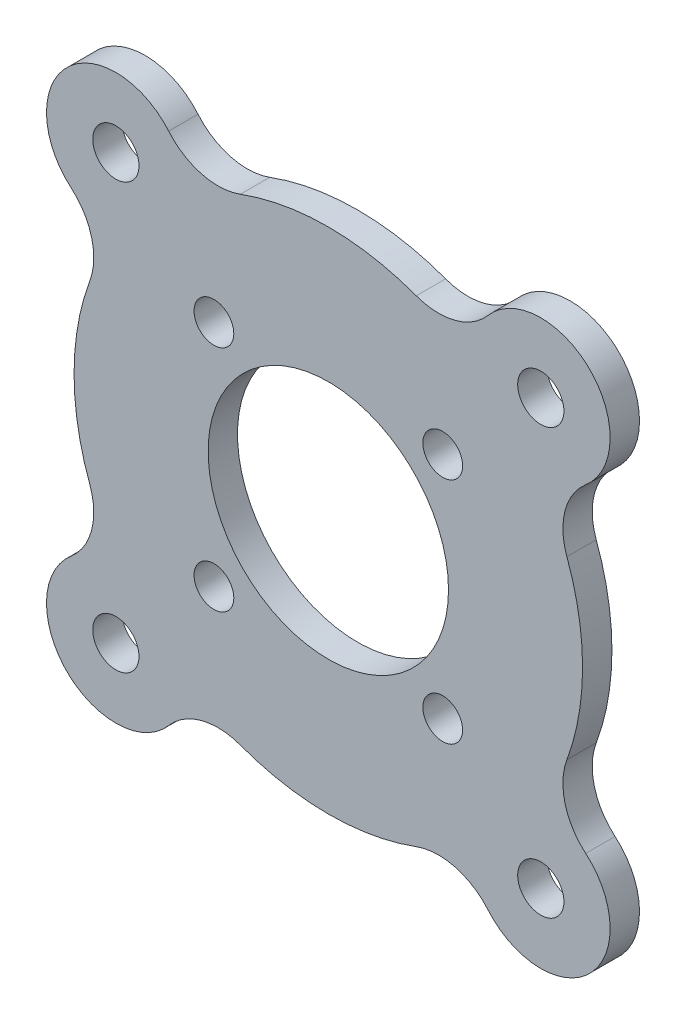
ISO-10303-21;
HEADER;
FILE_DESCRIPTION(('STEP AP214'),'2;1');
FILE_NAME('part.step','',(''),(''),'','','');
FILE_SCHEMA(('AUTOMOTIVE_DESIGN { 1 0 10303 214 1 1 1 1 }'));
ENDSEC;
DATA;
#1=APPLICATION_CONTEXT('core data for automotive mechanical design processes');
#2=APPLICATION_PROTOCOL_DEFINITION('international standard','automotive_design',2000,#1);
#3=PRODUCT_CONTEXT('',#1,'mechanical');
#4=PRODUCT('Part','Part','',(#3));
#5=PRODUCT_RELATED_PRODUCT_CATEGORY('part','',(#4));
#6=PRODUCT_DEFINITION_FORMATION('','',#4);
#7=PRODUCT_DEFINITION_CONTEXT('part definition',#1,'design');
#8=PRODUCT_DEFINITION('design','',#6,#7);
#9=PRODUCT_DEFINITION_SHAPE('','',#8);
#10=(LENGTH_UNIT() NAMED_UNIT(*) SI_UNIT(.MILLI.,.METRE.));
#11=(NAMED_UNIT(*) PLANE_ANGLE_UNIT() SI_UNIT($,.RADIAN.));
#12=(NAMED_UNIT(*) SI_UNIT($,.STERADIAN.) SOLID_ANGLE_UNIT());
#13=UNCERTAINTY_MEASURE_WITH_UNIT(LENGTH_MEASURE(1.E-05),#10,'distance_accuracy_value','');
#14=(GEOMETRIC_REPRESENTATION_CONTEXT(3) GLOBAL_UNCERTAINTY_ASSIGNED_CONTEXT((#13)) GLOBAL_UNIT_ASSIGNED_CONTEXT((#10,
#11,#12)) REPRESENTATION_CONTEXT('',''));
#15=CARTESIAN_POINT('',(0.,0.,0.));
#16=DIRECTION('',(0.,0.,1.));
#17=DIRECTION('',(1.,0.,0.));
#18=AXIS2_PLACEMENT_3D('',#15,#16,#17);
#19=CARTESIAN_POINT('',(22.9809703885628,-22.9809703885628,1.5875));
#20=DIRECTION('',(0.,0.,-1.));
#21=DIRECTION('',(-1.,0.,0.));
#22=AXIS2_PLACEMENT_3D('',#19,#20,#21);
#23=CYLINDRICAL_SURFACE('',#22,7.5);
#24=CARTESIAN_POINT('',(22.9809703885628,-22.9809703885628,-1.5875));
#25=DIRECTION('',(0.,0.,1.));
#26=DIRECTION('',(1.,0.,0.));
#27=AXIS2_PLACEMENT_3D('',#24,#25,#26);
#28=CIRCLE('',#27,7.5);
#29=CARTESIAN_POINT('',(17.2660064795565,-27.8378405246438,-1.5875));
#30=VERTEX_POINT('',#29);
#31=CARTESIAN_POINT('',(27.8378405246438,-17.2660064795565,-1.5875));
#32=VERTEX_POINT('',#31);
#33=EDGE_CURVE('E184',#30,#32,#28,.T.);
#34=ORIENTED_EDGE('',*,*,#33,.T.);
#35=DIRECTION('',(0.,0.,-1.));
#36=VECTOR('',#35,1.);
#37=CARTESIAN_POINT('',(27.8378405246438,-17.2660064795565,1.5875));
#38=LINE('',#37,#36);
#39=CARTESIAN_POINT('',(27.8378405246438,-17.2660064795565,1.5875));
#40=VERTEX_POINT('',#39);
#41=EDGE_CURVE('E201',#32,#40,#38,.F.);
#42=ORIENTED_EDGE('',*,*,#41,.T.);
#43=CARTESIAN_POINT('',(22.9809703885628,-22.9809703885628,1.5875));
#44=DIRECTION('',(0.,0.,1.));
#45=DIRECTION('',(1.,0.,0.));
#46=AXIS2_PLACEMENT_3D('',#43,#44,#45);
#47=CIRCLE('',#46,7.5);
#48=CARTESIAN_POINT('',(17.2660064795565,-27.8378405246438,1.5875));
#49=VERTEX_POINT('',#48);
#50=EDGE_CURVE('E288',#49,#40,#47,.T.);
#51=ORIENTED_EDGE('',*,*,#50,.F.);
#52=DIRECTION('',(0.,0.,-1.));
#53=VECTOR('',#52,1.);
#54=CARTESIAN_POINT('',(17.2660064795565,-27.8378405246438,1.5875));
#55=LINE('',#54,#53);
#56=EDGE_CURVE('E198',#49,#30,#55,.T.);
#57=ORIENTED_EDGE('',*,*,#56,.T.);
#58=EDGE_LOOP('',(#34,#42,#51,#57));
#59=FACE_BOUND('',#58,.T.);
#60=ADVANCED_FACE('F37',(#59),#23,.T.);
#61=CARTESIAN_POINT('',(0.,0.,1.5875));
#62=DIRECTION('',(0.,0.,-1.));
#63=DIRECTION('',(-1.,0.,0.));
#64=AXIS2_PLACEMENT_3D('',#61,#62,#63);
#65=CYLINDRICAL_SURFACE('',#64,27.5);
#66=CARTESIAN_POINT('',(0.,0.,-1.5875));
#67=DIRECTION('',(0.,0.,1.));
#68=DIRECTION('',(1.,0.,0.));
#69=AXIS2_PLACEMENT_3D('',#66,#67,#68);
#70=CIRCLE('',#69,27.5);
#71=CARTESIAN_POINT('',(25.8029067030082,-9.51104650792199,-1.5875));
#72=VERTEX_POINT('',#71);
#73=CARTESIAN_POINT('',(25.8029067030082,9.51104650792198,-1.5875));
#74=VERTEX_POINT('',#73);
#75=EDGE_CURVE('E179',#72,#74,#70,.T.);
#76=ORIENTED_EDGE('',*,*,#75,.T.);
#77=DIRECTION('',(0.,0.,-1.));
#78=VECTOR('',#77,1.);
#79=CARTESIAN_POINT('',(25.8029067030082,9.51104650792198,1.5875));
#80=LINE('',#79,#78);
#81=CARTESIAN_POINT('',(25.8029067030082,9.51104650792198,1.5875));
#82=VERTEX_POINT('',#81);
#83=EDGE_CURVE('E156',#74,#82,#80,.F.);
#84=ORIENTED_EDGE('',*,*,#83,.T.);
#85=CARTESIAN_POINT('',(0.,0.,1.5875));
#86=DIRECTION('',(0.,0.,1.));
#87=DIRECTION('',(1.,0.,0.));
#88=AXIS2_PLACEMENT_3D('',#85,#86,#87);
#89=CIRCLE('',#88,27.5);
#90=CARTESIAN_POINT('',(25.8029067030082,-9.51104650792199,1.5875));
#91=VERTEX_POINT('',#90);
#92=EDGE_CURVE('E269',#91,#82,#89,.T.);
#93=ORIENTED_EDGE('',*,*,#92,.F.);
#94=DIRECTION('',(0.,0.,-1.));
#95=VECTOR('',#94,1.);
#96=CARTESIAN_POINT('',(25.8029067030082,-9.51104650792199,1.5875));
#97=LINE('',#96,#95);
#98=EDGE_CURVE('E171',#91,#72,#97,.T.);
#99=ORIENTED_EDGE('',*,*,#98,.T.);
#100=EDGE_LOOP('',(#76,#84,#93,#99));
#101=FACE_BOUND('',#100,.T.);
#102=ADVANCED_FACE('F328',(#101),#65,.T.);
#103=CARTESIAN_POINT('',(22.9809703885628,22.9809703885628,1.5875));
#104=DIRECTION('',(0.,0.,-1.));
#105=DIRECTION('',(-1.,0.,0.));
#106=AXIS2_PLACEMENT_3D('',#103,#104,#105);
#107=CYLINDRICAL_SURFACE('',#106,7.5);
#108=CARTESIAN_POINT('',(22.9809703885628,22.9809703885628,1.5875));
#109=DIRECTION('',(0.,0.,1.));
#110=DIRECTION('',(1.,0.,0.));
#111=AXIS2_PLACEMENT_3D('',#108,#109,#110);
#112=CIRCLE('',#111,7.5);
#113=CARTESIAN_POINT('',(27.8378405246438,17.2660064795565,1.5875));
#114=VERTEX_POINT('',#113);
#115=CARTESIAN_POINT('',(17.2660064795565,27.8378405246438,1.5875));
#116=VERTEX_POINT('',#115);
#117=EDGE_CURVE('E170',#114,#116,#112,.T.);
#118=ORIENTED_EDGE('',*,*,#117,.F.);
#119=DIRECTION('',(0.,0.,-1.));
#120=VECTOR('',#119,1.);
#121=CARTESIAN_POINT('',(27.8378405246438,17.2660064795565,1.5875));
#122=LINE('',#121,#120);
#123=CARTESIAN_POINT('',(27.8378405246438,17.2660064795565,-1.5875));
#124=VERTEX_POINT('',#123);
#125=EDGE_CURVE('E155',#114,#124,#122,.T.);
#126=ORIENTED_EDGE('',*,*,#125,.T.);
#127=CARTESIAN_POINT('',(22.9809703885628,22.9809703885628,-1.5875));
#128=DIRECTION('',(0.,0.,1.));
#129=DIRECTION('',(1.,0.,0.));
#130=AXIS2_PLACEMENT_3D('',#127,#128,#129);
#131=CIRCLE('',#130,7.5);
#132=CARTESIAN_POINT('',(17.2660064795565,27.8378405246438,-1.5875));
#133=VERTEX_POINT('',#132);
#134=EDGE_CURVE('E168',#124,#133,#131,.T.);
#135=ORIENTED_EDGE('',*,*,#134,.T.);
#136=DIRECTION('',(0.,0.,-1.));
#137=VECTOR('',#136,1.);
#138=CARTESIAN_POINT('',(17.2660064795565,27.8378405246438,1.5875));
#139=LINE('',#138,#137);
#140=EDGE_CURVE('E172',#133,#116,#139,.F.);
#141=ORIENTED_EDGE('',*,*,#140,.T.);
#142=EDGE_LOOP('',(#118,#126,#135,#141));
#143=FACE_BOUND('',#142,.T.);
#144=ADVANCED_FACE('F167',(#143),#107,.T.);
#145=CARTESIAN_POINT('',(9.51104650792198,25.8029067030082,1.5875));
#146=VERTEX_POINT('',#145);
#147=CARTESIAN_POINT('',(-9.51104650792198,25.8029067030082,1.5875));
#148=VERTEX_POINT('',#147);
#149=EDGE_CURVE('E260',#146,#148,#89,.T.);
#150=ORIENTED_EDGE('',*,*,#149,.F.);
#151=DIRECTION('',(0.,0.,-1.));
#152=VECTOR('',#151,1.);
#153=CARTESIAN_POINT('',(9.51104650792198,25.8029067030082,1.5875));
#154=LINE('',#153,#152);
#155=CARTESIAN_POINT('',(9.51104650792198,25.8029067030082,-1.5875));
#156=VERTEX_POINT('',#155);
#157=EDGE_CURVE('E162',#146,#156,#154,.T.);
#158=ORIENTED_EDGE('',*,*,#157,.T.);
#159=CARTESIAN_POINT('',(-9.51104650792198,25.8029067030082,-1.5875));
#160=VERTEX_POINT('',#159);
#161=EDGE_CURVE('E178',#156,#160,#70,.T.);
#162=ORIENTED_EDGE('',*,*,#161,.T.);
#163=DIRECTION('',(0.,0.,-1.));
#164=VECTOR('',#163,1.);
#165=CARTESIAN_POINT('',(-9.51104650792198,25.8029067030082,1.5875));
#166=LINE('',#165,#164);
#167=EDGE_CURVE('E52',#160,#148,#166,.F.);
#168=ORIENTED_EDGE('',*,*,#167,.T.);
#169=EDGE_LOOP('',(#150,#158,#162,#168));
#170=FACE_BOUND('',#169,.T.);
#171=ADVANCED_FACE('F251',(#170),#65,.T.);
#172=CARTESIAN_POINT('',(-22.9809703885628,22.9809703885628,1.5875));
#173=DIRECTION('',(0.,0.,-1.));
#174=DIRECTION('',(-1.,0.,0.));
#175=AXIS2_PLACEMENT_3D('',#172,#173,#174);
#176=CYLINDRICAL_SURFACE('',#175,7.5);
#177=CARTESIAN_POINT('',(-22.9809703885628,22.9809703885628,-1.5875));
#178=DIRECTION('',(0.,0.,1.));
#179=DIRECTION('',(1.,0.,0.));
#180=AXIS2_PLACEMENT_3D('',#177,#178,#179);
#181=CIRCLE('',#180,7.5);
#182=CARTESIAN_POINT('',(-17.2660064795565,27.8378405246438,-1.5875));
#183=VERTEX_POINT('',#182);
#184=CARTESIAN_POINT('',(-27.8378405246438,17.2660064795565,-1.5875));
#185=VERTEX_POINT('',#184);
#186=EDGE_CURVE('E181',#183,#185,#181,.T.);
#187=ORIENTED_EDGE('',*,*,#186,.T.);
#188=DIRECTION('',(0.,0.,-1.));
#189=VECTOR('',#188,1.);
#190=CARTESIAN_POINT('',(-27.8378405246438,17.2660064795565,1.5875));
#191=LINE('',#190,#189);
#192=CARTESIAN_POINT('',(-27.8378405246438,17.2660064795565,1.5875));
#193=VERTEX_POINT('',#192);
#194=EDGE_CURVE('E221',#185,#193,#191,.F.);
#195=ORIENTED_EDGE('',*,*,#194,.T.);
#196=CARTESIAN_POINT('',(-22.9809703885628,22.9809703885628,1.5875));
#197=DIRECTION('',(0.,0.,1.));
#198=DIRECTION('',(1.,0.,0.));
#199=AXIS2_PLACEMENT_3D('',#196,#197,#198);
#200=CIRCLE('',#199,7.5);
#201=CARTESIAN_POINT('',(-17.2660064795565,27.8378405246438,1.5875));
#202=VERTEX_POINT('',#201);
#203=EDGE_CURVE('E258',#202,#193,#200,.T.);
#204=ORIENTED_EDGE('',*,*,#203,.F.);
#205=DIRECTION('',(0.,0.,-1.));
#206=VECTOR('',#205,1.);
#207=CARTESIAN_POINT('',(-17.2660064795565,27.8378405246438,1.5875));
#208=LINE('',#207,#206);
#209=EDGE_CURVE('E218',#202,#183,#208,.T.);
#210=ORIENTED_EDGE('',*,*,#209,.T.);
#211=EDGE_LOOP('',(#187,#195,#204,#210));
#212=FACE_BOUND('',#211,.T.);
#213=ADVANCED_FACE('F262',(#212),#176,.T.);
#214=CARTESIAN_POINT('',(-25.8029067030082,9.51104650792197,-1.5875));
#215=VERTEX_POINT('',#214);
#216=CARTESIAN_POINT('',(-25.8029067030082,-9.51104650792198,-1.5875));
#217=VERTEX_POINT('',#216);
#218=EDGE_CURVE('E183',#215,#217,#70,.T.);
#219=ORIENTED_EDGE('',*,*,#218,.T.);
#220=DIRECTION('',(0.,0.,-1.));
#221=VECTOR('',#220,1.);
#222=CARTESIAN_POINT('',(-25.8029067030082,-9.51104650792198,1.5875));
#223=LINE('',#222,#221);
#224=CARTESIAN_POINT('',(-25.8029067030082,-9.51104650792198,1.5875));
#225=VERTEX_POINT('',#224);
#226=EDGE_CURVE('E216',#217,#225,#223,.F.);
#227=ORIENTED_EDGE('',*,*,#226,.T.);
#228=CARTESIAN_POINT('',(-25.8029067030082,9.51104650792197,1.5875));
#229=VERTEX_POINT('',#228);
#230=EDGE_CURVE('E264',#229,#225,#89,.T.);
#231=ORIENTED_EDGE('',*,*,#230,.F.);
#232=DIRECTION('',(0.,0.,-1.));
#233=VECTOR('',#232,1.);
#234=CARTESIAN_POINT('',(-25.8029067030082,9.51104650792197,1.5875));
#235=LINE('',#234,#233);
#236=EDGE_CURVE('E213',#229,#215,#235,.T.);
#237=ORIENTED_EDGE('',*,*,#236,.T.);
#238=EDGE_LOOP('',(#219,#227,#231,#237));
#239=FACE_BOUND('',#238,.T.);
#240=ADVANCED_FACE('F301',(#239),#65,.T.);
#241=CARTESIAN_POINT('',(-22.9809703885628,-22.9809703885628,1.5875));
#242=DIRECTION('',(0.,0.,-1.));
#243=DIRECTION('',(-1.,0.,0.));
#244=AXIS2_PLACEMENT_3D('',#241,#242,#243);
#245=CYLINDRICAL_SURFACE('',#244,7.5);
#246=CARTESIAN_POINT('',(-22.9809703885628,-22.9809703885628,-1.5875));
#247=DIRECTION('',(0.,0.,1.));
#248=DIRECTION('',(1.,0.,0.));
#249=AXIS2_PLACEMENT_3D('',#246,#247,#248);
#250=CIRCLE('',#249,7.5);
#251=CARTESIAN_POINT('',(-27.8378405246438,-17.2660064795565,-1.5875));
#252=VERTEX_POINT('',#251);
#253=CARTESIAN_POINT('',(-17.2660064795565,-27.8378405246438,-1.5875));
#254=VERTEX_POINT('',#253);
#255=EDGE_CURVE('E190',#252,#254,#250,.T.);
#256=ORIENTED_EDGE('',*,*,#255,.T.);
#257=DIRECTION('',(0.,0.,-1.));
#258=VECTOR('',#257,1.);
#259=CARTESIAN_POINT('',(-17.2660064795565,-27.8378405246438,1.5875));
#260=LINE('',#259,#258);
#261=CARTESIAN_POINT('',(-17.2660064795565,-27.8378405246438,1.5875));
#262=VERTEX_POINT('',#261);
#263=EDGE_CURVE('E211',#254,#262,#260,.F.);
#264=ORIENTED_EDGE('',*,*,#263,.T.);
#265=CARTESIAN_POINT('',(-22.9809703885628,-22.9809703885628,1.5875));
#266=DIRECTION('',(0.,0.,1.));
#267=DIRECTION('',(1.,0.,0.));
#268=AXIS2_PLACEMENT_3D('',#265,#266,#267);
#269=CIRCLE('',#268,7.5);
#270=CARTESIAN_POINT('',(-27.8378405246438,-17.2660064795565,1.5875));
#271=VERTEX_POINT('',#270);
#272=EDGE_CURVE('E267',#271,#262,#269,.T.);
#273=ORIENTED_EDGE('',*,*,#272,.F.);
#274=DIRECTION('',(0.,0.,-1.));
#275=VECTOR('',#274,1.);
#276=CARTESIAN_POINT('',(-27.8378405246438,-17.2660064795565,1.5875));
#277=LINE('',#276,#275);
#278=EDGE_CURVE('E208',#271,#252,#277,.T.);
#279=ORIENTED_EDGE('',*,*,#278,.T.);
#280=EDGE_LOOP('',(#256,#264,#273,#279));
#281=FACE_BOUND('',#280,.T.);
#282=ADVANCED_FACE('F311',(#281),#245,.T.);
#283=CARTESIAN_POINT('',(-9.51104650792198,-25.8029067030082,-1.5875));
#284=VERTEX_POINT('',#283);
#285=CARTESIAN_POINT('',(9.51104650792198,-25.8029067030082,-1.5875));
#286=VERTEX_POINT('',#285);
#287=EDGE_CURVE('E185',#284,#286,#70,.T.);
#288=ORIENTED_EDGE('',*,*,#287,.T.);
#289=DIRECTION('',(0.,0.,-1.));
#290=VECTOR('',#289,1.);
#291=CARTESIAN_POINT('',(9.51104650792198,-25.8029067030082,1.5875));
#292=LINE('',#291,#290);
#293=CARTESIAN_POINT('',(9.51104650792198,-25.8029067030082,1.5875));
#294=VERTEX_POINT('',#293);
#295=EDGE_CURVE('E206',#286,#294,#292,.F.);
#296=ORIENTED_EDGE('',*,*,#295,.T.);
#297=CARTESIAN_POINT('',(-9.51104650792198,-25.8029067030082,1.5875));
#298=VERTEX_POINT('',#297);
#299=EDGE_CURVE('E193',#298,#294,#89,.T.);
#300=ORIENTED_EDGE('',*,*,#299,.F.);
#301=DIRECTION('',(0.,0.,-1.));
#302=VECTOR('',#301,1.);
#303=CARTESIAN_POINT('',(-9.51104650792198,-25.8029067030082,1.5875));
#304=LINE('',#303,#302);
#305=EDGE_CURVE('E203',#298,#284,#304,.T.);
#306=ORIENTED_EDGE('',*,*,#305,.T.);
#307=EDGE_LOOP('',(#288,#296,#300,#306));
#308=FACE_BOUND('',#307,.T.);
#309=ADVANCED_FACE('F319',(#308),#65,.T.);
#310=CARTESIAN_POINT('',(0.,0.,1.5875));
#311=DIRECTION('',(0.,0.,1.));
#312=DIRECTION('',(1.,0.,0.));
#313=AXIS2_PLACEMENT_3D('',#310,#311,#312);
#314=PLANE('',#313);
#315=CARTESIAN_POINT('',(-22.9809703885628,22.9809703885628,1.5875));
#316=DIRECTION('',(0.,0.,1.));
#317=DIRECTION('',(1.,0.,0.));
#318=AXIS2_PLACEMENT_3D('',#315,#316,#317);
#319=CIRCLE('',#318,2.49999999999999);
#320=CARTESIAN_POINT('',(-20.4809703885628,22.9809703885628,1.5875));
#321=VERTEX_POINT('',#320);
#322=EDGE_CURVE('E453',#321,#321,#319,.T.);
#323=ORIENTED_EDGE('',*,*,#322,.F.);
#324=EDGE_LOOP('',(#323));
#325=FACE_BOUND('',#324,.T.);
#326=CARTESIAN_POINT('',(22.9809703885628,22.9809703885628,1.5875));
#327=DIRECTION('',(0.,0.,1.));
#328=DIRECTION('',(1.,0.,0.));
#329=AXIS2_PLACEMENT_3D('',#326,#327,#328);
#330=CIRCLE('',#329,2.49999999999999);
#331=CARTESIAN_POINT('',(25.4809703885628,22.9809703885628,1.5875));
#332=VERTEX_POINT('',#331);
#333=EDGE_CURVE('E449',#332,#332,#330,.T.);
#334=ORIENTED_EDGE('',*,*,#333,.F.);
#335=EDGE_LOOP('',(#334));
#336=FACE_BOUND('',#335,.T.);
#337=CARTESIAN_POINT('',(22.9809703885628,-22.9809703885628,1.5875));
#338=DIRECTION('',(0.,0.,1.));
#339=DIRECTION('',(1.,0.,0.));
#340=AXIS2_PLACEMENT_3D('',#337,#338,#339);
#341=CIRCLE('',#340,2.49999999999999);
#342=CARTESIAN_POINT('',(25.4809703885628,-22.9809703885628,1.5875));
#343=VERTEX_POINT('',#342);
#344=EDGE_CURVE('E445',#343,#343,#341,.T.);
#345=ORIENTED_EDGE('',*,*,#344,.F.);
#346=EDGE_LOOP('',(#345));
#347=FACE_BOUND('',#346,.T.);
#348=CARTESIAN_POINT('',(-22.9809703885628,-22.9809703885628,1.5875));
#349=DIRECTION('',(0.,0.,1.));
#350=DIRECTION('',(1.,0.,0.));
#351=AXIS2_PLACEMENT_3D('',#348,#349,#350);
#352=CIRCLE('',#351,2.49999999999999);
#353=CARTESIAN_POINT('',(-20.4809703885628,-22.9809703885628,1.5875));
#354=VERTEX_POINT('',#353);
#355=EDGE_CURVE('E441',#354,#354,#352,.T.);
#356=ORIENTED_EDGE('',*,*,#355,.F.);
#357=EDGE_LOOP('',(#356));
#358=FACE_BOUND('',#357,.T.);
#359=CARTESIAN_POINT('',(-12.3743686707646,12.3743686707646,1.5875));
#360=DIRECTION('',(0.,0.,1.));
#361=DIRECTION('',(1.,0.,0.));
#362=AXIS2_PLACEMENT_3D('',#359,#360,#361);
#363=CIRCLE('',#362,2.14999999999999);
#364=CARTESIAN_POINT('',(-10.2243686707646,12.3743686707646,1.5875));
#365=VERTEX_POINT('',#364);
#366=EDGE_CURVE('E437',#365,#365,#363,.T.);
#367=ORIENTED_EDGE('',*,*,#366,.F.);
#368=EDGE_LOOP('',(#367));
#369=FACE_BOUND('',#368,.T.);
#370=CARTESIAN_POINT('',(12.3743686707646,12.3743686707646,1.5875));
#371=DIRECTION('',(0.,0.,1.));
#372=DIRECTION('',(1.,0.,0.));
#373=AXIS2_PLACEMENT_3D('',#370,#371,#372);
#374=CIRCLE('',#373,2.14999999999999);
#375=CARTESIAN_POINT('',(14.5243686707646,12.3743686707646,1.5875));
#376=VERTEX_POINT('',#375);
#377=EDGE_CURVE('E433',#376,#376,#374,.T.);
#378=ORIENTED_EDGE('',*,*,#377,.F.);
#379=EDGE_LOOP('',(#378));
#380=FACE_BOUND('',#379,.T.);
#381=CARTESIAN_POINT('',(12.3743686707646,-12.3743686707646,1.5875));
#382=DIRECTION('',(0.,0.,1.));
#383=DIRECTION('',(1.,0.,0.));
#384=AXIS2_PLACEMENT_3D('',#381,#382,#383);
#385=CIRCLE('',#384,2.14999999999999);
#386=CARTESIAN_POINT('',(14.5243686707646,-12.3743686707646,1.5875));
#387=VERTEX_POINT('',#386);
#388=EDGE_CURVE('E427',#387,#387,#385,.T.);
#389=ORIENTED_EDGE('',*,*,#388,.F.);
#390=EDGE_LOOP('',(#389));
#391=FACE_BOUND('',#390,.T.);
#392=CARTESIAN_POINT('',(-12.3743686707646,-12.3743686707646,1.5875));
#393=DIRECTION('',(0.,0.,1.));
#394=DIRECTION('',(1.,0.,0.));
#395=AXIS2_PLACEMENT_3D('',#392,#393,#394);
#396=CIRCLE('',#395,2.14999999999999);
#397=CARTESIAN_POINT('',(-10.2243686707646,-12.3743686707646,1.5875));
#398=VERTEX_POINT('',#397);
#399=EDGE_CURVE('E423',#398,#398,#396,.T.);
#400=ORIENTED_EDGE('',*,*,#399,.F.);
#401=EDGE_LOOP('',(#400));
#402=FACE_BOUND('',#401,.T.);
#403=CARTESIAN_POINT('',(0.,0.,1.5875));
#404=DIRECTION('',(0.,0.,1.));
#405=DIRECTION('',(1.,0.,0.));
#406=AXIS2_PLACEMENT_3D('',#403,#404,#405);
#407=CIRCLE('',#406,13.);
#408=CARTESIAN_POINT('',(13.,0.,1.5875));
#409=VERTEX_POINT('',#408);
#410=EDGE_CURVE('E278',#409,#409,#407,.T.);
#411=ORIENTED_EDGE('',*,*,#410,.F.);
#412=EDGE_LOOP('',(#411));
#413=FACE_BOUND('',#412,.T.);
#414=ORIENTED_EDGE('',*,*,#299,.T.);
#415=CARTESIAN_POINT('',(11.9320401644839,-32.3709193183194,1.5875));
#416=DIRECTION('',(0.,0.,1.));
#417=DIRECTION('',(1.,0.,0.));
#418=AXIS2_PLACEMENT_3D('',#415,#416,#417);
#419=CIRCLE('',#418,7.);
#420=EDGE_CURVE('E233',#294,#49,#419,.F.);
#421=ORIENTED_EDGE('',*,*,#420,.T.);
#422=ORIENTED_EDGE('',*,*,#50,.T.);
#423=CARTESIAN_POINT('',(32.3709193183194,-11.932040164484,1.5875));
#424=DIRECTION('',(0.,0.,1.));
#425=DIRECTION('',(1.,0.,0.));
#426=AXIS2_PLACEMENT_3D('',#423,#424,#425);
#427=CIRCLE('',#426,7.);
#428=EDGE_CURVE('E229',#40,#91,#427,.F.);
#429=ORIENTED_EDGE('',*,*,#428,.T.);
#430=ORIENTED_EDGE('',*,*,#92,.T.);
#431=CARTESIAN_POINT('',(32.3709193183194,11.9320401644839,1.5875));
#432=DIRECTION('',(0.,0.,1.));
#433=DIRECTION('',(1.,0.,0.));
#434=AXIS2_PLACEMENT_3D('',#431,#432,#433);
#435=CIRCLE('',#434,7.);
#436=EDGE_CURVE('E161',#82,#114,#435,.F.);
#437=ORIENTED_EDGE('',*,*,#436,.T.);
#438=ORIENTED_EDGE('',*,*,#117,.T.);
#439=CARTESIAN_POINT('',(11.9320401644839,32.3709193183194,1.5875));
#440=DIRECTION('',(0.,0.,1.));
#441=DIRECTION('',(1.,0.,0.));
#442=AXIS2_PLACEMENT_3D('',#439,#440,#441);
#443=CIRCLE('',#442,7.);
#444=EDGE_CURVE('E59',#116,#146,#443,.F.);
#445=ORIENTED_EDGE('',*,*,#444,.T.);
#446=ORIENTED_EDGE('',*,*,#149,.T.);
#447=CARTESIAN_POINT('',(-11.9320401644839,32.3709193183194,1.5875));
#448=DIRECTION('',(0.,0.,1.));
#449=DIRECTION('',(1.,0.,0.));
#450=AXIS2_PLACEMENT_3D('',#447,#448,#449);
#451=CIRCLE('',#450,7.);
#452=EDGE_CURVE('E11',#148,#202,#451,.F.);
#453=ORIENTED_EDGE('',*,*,#452,.T.);
#454=ORIENTED_EDGE('',*,*,#203,.T.);
#455=CARTESIAN_POINT('',(-32.3709193183194,11.9320401644839,1.5875));
#456=DIRECTION('',(0.,0.,1.));
#457=DIRECTION('',(1.,0.,0.));
#458=AXIS2_PLACEMENT_3D('',#455,#456,#457);
#459=CIRCLE('',#458,7.);
#460=EDGE_CURVE('E245',#193,#229,#459,.F.);
#461=ORIENTED_EDGE('',*,*,#460,.T.);
#462=ORIENTED_EDGE('',*,*,#230,.T.);
#463=CARTESIAN_POINT('',(-32.3709193183194,-11.9320401644839,1.5875));
#464=DIRECTION('',(0.,0.,1.));
#465=DIRECTION('',(1.,0.,0.));
#466=AXIS2_PLACEMENT_3D('',#463,#464,#465);
#467=CIRCLE('',#466,7.);
#468=EDGE_CURVE('E241',#225,#271,#467,.F.);
#469=ORIENTED_EDGE('',*,*,#468,.T.);
#470=ORIENTED_EDGE('',*,*,#272,.T.);
#471=CARTESIAN_POINT('',(-11.9320401644839,-32.3709193183194,1.5875));
#472=DIRECTION('',(0.,0.,1.));
#473=DIRECTION('',(1.,0.,0.));
#474=AXIS2_PLACEMENT_3D('',#471,#472,#473);
#475=CIRCLE('',#474,7.);
#476=EDGE_CURVE('E237',#262,#298,#475,.F.);
#477=ORIENTED_EDGE('',*,*,#476,.T.);
#478=EDGE_LOOP('',(#414,#421,#422,#429,#430,#437,#438,#445,#446,#453,#454,#461,#462,#469,#470,#477));
#479=FACE_BOUND('',#478,.T.);
#480=ADVANCED_FACE('F257',(#325,#336,#347,#358,#369,#380,#391,#402,#413,#479),#314,.T.);
#481=CARTESIAN_POINT('',(0.,0.,-1.5875));
#482=DIRECTION('',(0.,0.,1.));
#483=DIRECTION('',(1.,0.,0.));
#484=AXIS2_PLACEMENT_3D('',#481,#482,#483);
#485=PLANE('',#484);
#486=CARTESIAN_POINT('',(-22.9809703885628,22.9809703885628,-1.5875));
#487=DIRECTION('',(0.,0.,1.));
#488=DIRECTION('',(1.,0.,0.));
#489=AXIS2_PLACEMENT_3D('',#486,#487,#488);
#490=CIRCLE('',#489,2.5);
#491=CARTESIAN_POINT('',(-20.4809703885628,22.9809703885628,-1.5875));
#492=VERTEX_POINT('',#491);
#493=EDGE_CURVE('E396',#492,#492,#490,.T.);
#494=ORIENTED_EDGE('',*,*,#493,.T.);
#495=EDGE_LOOP('',(#494));
#496=FACE_BOUND('',#495,.T.);
#497=CARTESIAN_POINT('',(22.9809703885628,22.9809703885628,-1.5875));
#498=DIRECTION('',(0.,0.,1.));
#499=DIRECTION('',(1.,0.,0.));
#500=AXIS2_PLACEMENT_3D('',#497,#498,#499);
#501=CIRCLE('',#500,2.5);
#502=CARTESIAN_POINT('',(25.4809703885628,22.9809703885628,-1.5875));
#503=VERTEX_POINT('',#502);
#504=EDGE_CURVE('E400',#503,#503,#501,.T.);
#505=ORIENTED_EDGE('',*,*,#504,.T.);
#506=EDGE_LOOP('',(#505));
#507=FACE_BOUND('',#506,.T.);
#508=CARTESIAN_POINT('',(22.9809703885628,-22.9809703885628,-1.5875));
#509=DIRECTION('',(0.,0.,1.));
#510=DIRECTION('',(1.,0.,0.));
#511=AXIS2_PLACEMENT_3D('',#508,#509,#510);
#512=CIRCLE('',#511,2.5);
#513=CARTESIAN_POINT('',(25.4809703885628,-22.9809703885628,-1.5875));
#514=VERTEX_POINT('',#513);
#515=EDGE_CURVE('E404',#514,#514,#512,.T.);
#516=ORIENTED_EDGE('',*,*,#515,.T.);
#517=EDGE_LOOP('',(#516));
#518=FACE_BOUND('',#517,.T.);
#519=CARTESIAN_POINT('',(-22.9809703885628,-22.9809703885628,-1.5875));
#520=DIRECTION('',(0.,0.,1.));
#521=DIRECTION('',(1.,0.,0.));
#522=AXIS2_PLACEMENT_3D('',#519,#520,#521);
#523=CIRCLE('',#522,2.5);
#524=CARTESIAN_POINT('',(-20.4809703885628,-22.9809703885628,-1.5875));
#525=VERTEX_POINT('',#524);
#526=EDGE_CURVE('E408',#525,#525,#523,.T.);
#527=ORIENTED_EDGE('',*,*,#526,.T.);
#528=EDGE_LOOP('',(#527));
#529=FACE_BOUND('',#528,.T.);
#530=CARTESIAN_POINT('',(-12.3743686707646,12.3743686707646,-1.5875));
#531=DIRECTION('',(0.,0.,1.));
#532=DIRECTION('',(1.,0.,0.));
#533=AXIS2_PLACEMENT_3D('',#530,#531,#532);
#534=CIRCLE('',#533,2.15);
#535=CARTESIAN_POINT('',(-10.2243686707646,12.3743686707646,-1.5875));
#536=VERTEX_POINT('',#535);
#537=EDGE_CURVE('E412',#536,#536,#534,.T.);
#538=ORIENTED_EDGE('',*,*,#537,.T.);
#539=EDGE_LOOP('',(#538));
#540=FACE_BOUND('',#539,.T.);
#541=CARTESIAN_POINT('',(12.3743686707646,12.3743686707646,-1.5875));
#542=DIRECTION('',(0.,0.,1.));
#543=DIRECTION('',(1.,0.,0.));
#544=AXIS2_PLACEMENT_3D('',#541,#542,#543);
#545=CIRCLE('',#544,2.15);
#546=CARTESIAN_POINT('',(14.5243686707646,12.3743686707646,-1.5875));
#547=VERTEX_POINT('',#546);
#548=EDGE_CURVE('E416',#547,#547,#545,.T.);
#549=ORIENTED_EDGE('',*,*,#548,.T.);
#550=EDGE_LOOP('',(#549));
#551=FACE_BOUND('',#550,.T.);
#552=CARTESIAN_POINT('',(12.3743686707646,-12.3743686707646,-1.5875));
#553=DIRECTION('',(0.,0.,1.));
#554=DIRECTION('',(1.,0.,0.));
#555=AXIS2_PLACEMENT_3D('',#552,#553,#554);
#556=CIRCLE('',#555,2.15);
#557=CARTESIAN_POINT('',(14.5243686707646,-12.3743686707646,-1.5875));
#558=VERTEX_POINT('',#557);
#559=EDGE_CURVE('E420',#558,#558,#556,.T.);
#560=ORIENTED_EDGE('',*,*,#559,.T.);
#561=EDGE_LOOP('',(#560));
#562=FACE_BOUND('',#561,.T.);
#563=CARTESIAN_POINT('',(-12.3743686707646,-12.3743686707646,-1.5875));
#564=DIRECTION('',(0.,0.,1.));
#565=DIRECTION('',(1.,0.,0.));
#566=AXIS2_PLACEMENT_3D('',#563,#564,#565);
#567=CIRCLE('',#566,2.15);
#568=CARTESIAN_POINT('',(-10.2243686707646,-12.3743686707646,-1.5875));
#569=VERTEX_POINT('',#568);
#570=EDGE_CURVE('E283',#569,#569,#567,.T.);
#571=ORIENTED_EDGE('',*,*,#570,.T.);
#572=EDGE_LOOP('',(#571));
#573=FACE_BOUND('',#572,.T.);
#574=CARTESIAN_POINT('',(0.,0.,-1.5875));
#575=DIRECTION('',(0.,0.,1.));
#576=DIRECTION('',(1.,0.,0.));
#577=AXIS2_PLACEMENT_3D('',#574,#575,#576);
#578=CIRCLE('',#577,13.);
#579=CARTESIAN_POINT('',(13.,0.,-1.5875));
#580=VERTEX_POINT('',#579);
#581=EDGE_CURVE('E274',#580,#580,#578,.T.);
#582=ORIENTED_EDGE('',*,*,#581,.T.);
#583=EDGE_LOOP('',(#582));
#584=FACE_BOUND('',#583,.T.);
#585=ORIENTED_EDGE('',*,*,#33,.F.);
#586=CARTESIAN_POINT('',(11.9320401644839,-32.3709193183194,-1.5875));
#587=DIRECTION('',(0.,0.,1.));
#588=DIRECTION('',(1.,0.,0.));
#589=AXIS2_PLACEMENT_3D('',#586,#587,#588);
#590=CIRCLE('',#589,7.);
#591=EDGE_CURVE('E231',#30,#286,#590,.T.);
#592=ORIENTED_EDGE('',*,*,#591,.T.);
#593=ORIENTED_EDGE('',*,*,#287,.F.);
#594=CARTESIAN_POINT('',(-11.9320401644839,-32.3709193183194,-1.5875));
#595=DIRECTION('',(0.,0.,1.));
#596=DIRECTION('',(1.,0.,0.));
#597=AXIS2_PLACEMENT_3D('',#594,#595,#596);
#598=CIRCLE('',#597,7.);
#599=EDGE_CURVE('E235',#284,#254,#598,.T.);
#600=ORIENTED_EDGE('',*,*,#599,.T.);
#601=ORIENTED_EDGE('',*,*,#255,.F.);
#602=CARTESIAN_POINT('',(-32.3709193183194,-11.9320401644839,-1.5875));
#603=DIRECTION('',(0.,0.,1.));
#604=DIRECTION('',(1.,0.,0.));
#605=AXIS2_PLACEMENT_3D('',#602,#603,#604);
#606=CIRCLE('',#605,7.);
#607=EDGE_CURVE('E239',#252,#217,#606,.T.);
#608=ORIENTED_EDGE('',*,*,#607,.T.);
#609=ORIENTED_EDGE('',*,*,#218,.F.);
#610=CARTESIAN_POINT('',(-32.3709193183194,11.9320401644839,-1.5875));
#611=DIRECTION('',(0.,0.,1.));
#612=DIRECTION('',(1.,0.,0.));
#613=AXIS2_PLACEMENT_3D('',#610,#611,#612);
#614=CIRCLE('',#613,7.);
#615=EDGE_CURVE('E243',#215,#185,#614,.T.);
#616=ORIENTED_EDGE('',*,*,#615,.T.);
#617=ORIENTED_EDGE('',*,*,#186,.F.);
#618=CARTESIAN_POINT('',(-11.9320401644839,32.3709193183194,-1.5875));
#619=DIRECTION('',(0.,0.,1.));
#620=DIRECTION('',(1.,0.,0.));
#621=AXIS2_PLACEMENT_3D('',#618,#619,#620);
#622=CIRCLE('',#621,7.);
#623=EDGE_CURVE('E45',#183,#160,#622,.T.);
#624=ORIENTED_EDGE('',*,*,#623,.T.);
#625=ORIENTED_EDGE('',*,*,#161,.F.);
#626=CARTESIAN_POINT('',(11.9320401644839,32.3709193183194,-1.5875));
#627=DIRECTION('',(0.,0.,1.));
#628=DIRECTION('',(1.,0.,0.));
#629=AXIS2_PLACEMENT_3D('',#626,#627,#628);
#630=CIRCLE('',#629,7.);
#631=EDGE_CURVE('E177',#156,#133,#630,.T.);
#632=ORIENTED_EDGE('',*,*,#631,.T.);
#633=ORIENTED_EDGE('',*,*,#134,.F.);
#634=CARTESIAN_POINT('',(32.3709193183194,11.9320401644839,-1.5875));
#635=DIRECTION('',(0.,0.,1.));
#636=DIRECTION('',(1.,0.,0.));
#637=AXIS2_PLACEMENT_3D('',#634,#635,#636);
#638=CIRCLE('',#637,7.);
#639=EDGE_CURVE('E151',#124,#74,#638,.T.);
#640=ORIENTED_EDGE('',*,*,#639,.T.);
#641=ORIENTED_EDGE('',*,*,#75,.F.);
#642=CARTESIAN_POINT('',(32.3709193183194,-11.932040164484,-1.5875));
#643=DIRECTION('',(0.,0.,1.));
#644=DIRECTION('',(1.,0.,0.));
#645=AXIS2_PLACEMENT_3D('',#642,#643,#644);
#646=CIRCLE('',#645,7.);
#647=EDGE_CURVE('E227',#72,#32,#646,.T.);
#648=ORIENTED_EDGE('',*,*,#647,.T.);
#649=EDGE_LOOP('',(#585,#592,#593,#600,#601,#608,#609,#616,#617,#624,#625,#632,#633,#640,#641,#648));
#650=FACE_BOUND('',#649,.T.);
#651=ADVANCED_FACE('F175',(#496,#507,#518,#529,#540,#551,#562,#573,#584,#650),#485,.F.);
#652=CARTESIAN_POINT('',(32.3709193183194,11.9320401644839,1.5875));
#653=DIRECTION('',(0.,0.,1.));
#654=DIRECTION('',(1.,0.,0.));
#655=AXIS2_PLACEMENT_3D('',#652,#653,#654);
#656=CYLINDRICAL_SURFACE('',#655,7.);
#657=ORIENTED_EDGE('',*,*,#436,.F.);
#658=ORIENTED_EDGE('',*,*,#83,.F.);
#659=ORIENTED_EDGE('',*,*,#639,.F.);
#660=ORIENTED_EDGE('',*,*,#125,.F.);
#661=EDGE_LOOP('',(#657,#658,#659,#660));
#662=FACE_BOUND('',#661,.T.);
#663=ADVANCED_FACE('F154',(#662),#656,.F.);
#664=CARTESIAN_POINT('',(32.3709193183194,-11.932040164484,1.5875));
#665=DIRECTION('',(0.,0.,1.));
#666=DIRECTION('',(1.,0.,0.));
#667=AXIS2_PLACEMENT_3D('',#664,#665,#666);
#668=CYLINDRICAL_SURFACE('',#667,7.);
#669=ORIENTED_EDGE('',*,*,#428,.F.);
#670=ORIENTED_EDGE('',*,*,#41,.F.);
#671=ORIENTED_EDGE('',*,*,#647,.F.);
#672=ORIENTED_EDGE('',*,*,#98,.F.);
#673=EDGE_LOOP('',(#669,#670,#671,#672));
#674=FACE_BOUND('',#673,.T.);
#675=ADVANCED_FACE('F324',(#674),#668,.F.);
#676=CARTESIAN_POINT('',(11.9320401644839,-32.3709193183194,1.5875));
#677=DIRECTION('',(0.,0.,1.));
#678=DIRECTION('',(1.,0.,0.));
#679=AXIS2_PLACEMENT_3D('',#676,#677,#678);
#680=CYLINDRICAL_SURFACE('',#679,7.);
#681=ORIENTED_EDGE('',*,*,#420,.F.);
#682=ORIENTED_EDGE('',*,*,#295,.F.);
#683=ORIENTED_EDGE('',*,*,#591,.F.);
#684=ORIENTED_EDGE('',*,*,#56,.F.);
#685=EDGE_LOOP('',(#681,#682,#683,#684));
#686=FACE_BOUND('',#685,.T.);
#687=ADVANCED_FACE('F321',(#686),#680,.F.);
#688=CARTESIAN_POINT('',(-11.9320401644839,-32.3709193183194,1.5875));
#689=DIRECTION('',(0.,0.,1.));
#690=DIRECTION('',(1.,0.,0.));
#691=AXIS2_PLACEMENT_3D('',#688,#689,#690);
#692=CYLINDRICAL_SURFACE('',#691,7.);
#693=ORIENTED_EDGE('',*,*,#476,.F.);
#694=ORIENTED_EDGE('',*,*,#263,.F.);
#695=ORIENTED_EDGE('',*,*,#599,.F.);
#696=ORIENTED_EDGE('',*,*,#305,.F.);
#697=EDGE_LOOP('',(#693,#694,#695,#696));
#698=FACE_BOUND('',#697,.T.);
#699=ADVANCED_FACE('F315',(#698),#692,.F.);
#700=CARTESIAN_POINT('',(-32.3709193183194,-11.9320401644839,1.5875));
#701=DIRECTION('',(0.,0.,1.));
#702=DIRECTION('',(1.,0.,0.));
#703=AXIS2_PLACEMENT_3D('',#700,#701,#702);
#704=CYLINDRICAL_SURFACE('',#703,7.);
#705=ORIENTED_EDGE('',*,*,#468,.F.);
#706=ORIENTED_EDGE('',*,*,#226,.F.);
#707=ORIENTED_EDGE('',*,*,#607,.F.);
#708=ORIENTED_EDGE('',*,*,#278,.F.);
#709=EDGE_LOOP('',(#705,#706,#707,#708));
#710=FACE_BOUND('',#709,.T.);
#711=ADVANCED_FACE('F306',(#710),#704,.F.);
#712=CARTESIAN_POINT('',(-32.3709193183194,11.9320401644839,1.5875));
#713=DIRECTION('',(0.,0.,1.));
#714=DIRECTION('',(1.,0.,0.));
#715=AXIS2_PLACEMENT_3D('',#712,#713,#714);
#716=CYLINDRICAL_SURFACE('',#715,7.);
#717=ORIENTED_EDGE('',*,*,#460,.F.);
#718=ORIENTED_EDGE('',*,*,#194,.F.);
#719=ORIENTED_EDGE('',*,*,#615,.F.);
#720=ORIENTED_EDGE('',*,*,#236,.F.);
#721=EDGE_LOOP('',(#717,#718,#719,#720));
#722=FACE_BOUND('',#721,.T.);
#723=ADVANCED_FACE('F365',(#722),#716,.F.);
#724=CARTESIAN_POINT('',(11.9320401644839,32.3709193183194,1.5875));
#725=DIRECTION('',(0.,0.,1.));
#726=DIRECTION('',(1.,0.,0.));
#727=AXIS2_PLACEMENT_3D('',#724,#725,#726);
#728=CYLINDRICAL_SURFACE('',#727,7.);
#729=ORIENTED_EDGE('',*,*,#444,.F.);
#730=ORIENTED_EDGE('',*,*,#140,.F.);
#731=ORIENTED_EDGE('',*,*,#631,.F.);
#732=ORIENTED_EDGE('',*,*,#157,.F.);
#733=EDGE_LOOP('',(#729,#730,#731,#732));
#734=FACE_BOUND('',#733,.T.);
#735=ADVANCED_FACE('F367',(#734),#728,.F.);
#736=CARTESIAN_POINT('',(-11.9320401644839,32.3709193183194,1.5875));
#737=DIRECTION('',(0.,0.,1.));
#738=DIRECTION('',(1.,0.,0.));
#739=AXIS2_PLACEMENT_3D('',#736,#737,#738);
#740=CYLINDRICAL_SURFACE('',#739,7.);
#741=ORIENTED_EDGE('',*,*,#452,.F.);
#742=ORIENTED_EDGE('',*,*,#167,.F.);
#743=ORIENTED_EDGE('',*,*,#623,.F.);
#744=ORIENTED_EDGE('',*,*,#209,.F.);
#745=EDGE_LOOP('',(#741,#742,#743,#744));
#746=FACE_BOUND('',#745,.T.);
#747=ADVANCED_FACE('F39',(#746),#740,.F.);
#748=CARTESIAN_POINT('',(0.,0.,-1.5875));
#749=DIRECTION('',(0.,0.,1.));
#750=DIRECTION('',(1.,0.,0.));
#751=AXIS2_PLACEMENT_3D('',#748,#749,#750);
#752=CYLINDRICAL_SURFACE('',#751,13.);
#753=ORIENTED_EDGE('',*,*,#581,.F.);
#754=EDGE_LOOP('',(#753));
#755=FACE_BOUND('',#754,.T.);
#756=ORIENTED_EDGE('',*,*,#410,.T.);
#757=EDGE_LOOP('',(#756));
#758=FACE_BOUND('',#757,.T.);
#759=ADVANCED_FACE('F374',(#755,#758),#752,.F.);
#760=CARTESIAN_POINT('',(-12.3743686707646,-12.3743686707646,1.5875));
#761=DIRECTION('',(0.,0.,1.));
#762=DIRECTION('',(1.,0.,0.));
#763=AXIS2_PLACEMENT_3D('',#760,#761,#762);
#764=CYLINDRICAL_SURFACE('',#763,2.14999999999999);
#765=ORIENTED_EDGE('',*,*,#570,.F.);
#766=EDGE_LOOP('',(#765));
#767=FACE_BOUND('',#766,.T.);
#768=ORIENTED_EDGE('',*,*,#399,.T.);
#769=EDGE_LOOP('',(#768));
#770=FACE_BOUND('',#769,.T.);
#771=ADVANCED_FACE('F378',(#767,#770),#764,.F.);
#772=CARTESIAN_POINT('',(12.3743686707646,-12.3743686707646,1.5875));
#773=DIRECTION('',(0.,0.,1.));
#774=DIRECTION('',(1.,0.,0.));
#775=AXIS2_PLACEMENT_3D('',#772,#773,#774);
#776=CYLINDRICAL_SURFACE('',#775,2.14999999999999);
#777=ORIENTED_EDGE('',*,*,#559,.F.);
#778=EDGE_LOOP('',(#777));
#779=FACE_BOUND('',#778,.T.);
#780=ORIENTED_EDGE('',*,*,#388,.T.);
#781=EDGE_LOOP('',(#780));
#782=FACE_BOUND('',#781,.T.);
#783=ADVANCED_FACE('F384',(#779,#782),#776,.F.);
#784=CARTESIAN_POINT('',(12.3743686707646,12.3743686707646,1.5875));
#785=DIRECTION('',(0.,0.,1.));
#786=DIRECTION('',(1.,0.,0.));
#787=AXIS2_PLACEMENT_3D('',#784,#785,#786);
#788=CYLINDRICAL_SURFACE('',#787,2.14999999999999);
#789=ORIENTED_EDGE('',*,*,#548,.F.);
#790=EDGE_LOOP('',(#789));
#791=FACE_BOUND('',#790,.T.);
#792=ORIENTED_EDGE('',*,*,#377,.T.);
#793=EDGE_LOOP('',(#792));
#794=FACE_BOUND('',#793,.T.);
#795=ADVANCED_FACE('F475',(#791,#794),#788,.F.);
#796=CARTESIAN_POINT('',(-12.3743686707646,12.3743686707646,1.5875));
#797=DIRECTION('',(0.,0.,1.));
#798=DIRECTION('',(1.,0.,0.));
#799=AXIS2_PLACEMENT_3D('',#796,#797,#798);
#800=CYLINDRICAL_SURFACE('',#799,2.14999999999999);
#801=ORIENTED_EDGE('',*,*,#537,.F.);
#802=EDGE_LOOP('',(#801));
#803=FACE_BOUND('',#802,.T.);
#804=ORIENTED_EDGE('',*,*,#366,.T.);
#805=EDGE_LOOP('',(#804));
#806=FACE_BOUND('',#805,.T.);
#807=ADVANCED_FACE('F480',(#803,#806),#800,.F.);
#808=CARTESIAN_POINT('',(-22.9809703885628,-22.9809703885628,1.5875));
#809=DIRECTION('',(0.,0.,1.));
#810=DIRECTION('',(1.,0.,0.));
#811=AXIS2_PLACEMENT_3D('',#808,#809,#810);
#812=CYLINDRICAL_SURFACE('',#811,2.49999999999999);
#813=ORIENTED_EDGE('',*,*,#526,.F.);
#814=EDGE_LOOP('',(#813));
#815=FACE_BOUND('',#814,.T.);
#816=ORIENTED_EDGE('',*,*,#355,.T.);
#817=EDGE_LOOP('',(#816));
#818=FACE_BOUND('',#817,.T.);
#819=ADVANCED_FACE('F486',(#815,#818),#812,.F.);
#820=CARTESIAN_POINT('',(22.9809703885628,-22.9809703885628,1.5875));
#821=DIRECTION('',(0.,0.,1.));
#822=DIRECTION('',(1.,0.,0.));
#823=AXIS2_PLACEMENT_3D('',#820,#821,#822);
#824=CYLINDRICAL_SURFACE('',#823,2.49999999999999);
#825=ORIENTED_EDGE('',*,*,#515,.F.);
#826=EDGE_LOOP('',(#825));
#827=FACE_BOUND('',#826,.T.);
#828=ORIENTED_EDGE('',*,*,#344,.T.);
#829=EDGE_LOOP('',(#828));
#830=FACE_BOUND('',#829,.T.);
#831=ADVANCED_FACE('F490',(#827,#830),#824,.F.);
#832=CARTESIAN_POINT('',(22.9809703885628,22.9809703885628,1.5875));
#833=DIRECTION('',(0.,0.,1.));
#834=DIRECTION('',(1.,0.,0.));
#835=AXIS2_PLACEMENT_3D('',#832,#833,#834);
#836=CYLINDRICAL_SURFACE('',#835,2.49999999999999);
#837=ORIENTED_EDGE('',*,*,#504,.F.);
#838=EDGE_LOOP('',(#837));
#839=FACE_BOUND('',#838,.T.);
#840=ORIENTED_EDGE('',*,*,#333,.T.);
#841=EDGE_LOOP('',(#840));
#842=FACE_BOUND('',#841,.T.);
#843=ADVANCED_FACE('F494',(#839,#842),#836,.F.);
#844=CARTESIAN_POINT('',(-22.9809703885628,22.9809703885628,1.5875));
#845=DIRECTION('',(0.,0.,1.));
#846=DIRECTION('',(1.,0.,0.));
#847=AXIS2_PLACEMENT_3D('',#844,#845,#846);
#848=CYLINDRICAL_SURFACE('',#847,2.49999999999999);
#849=ORIENTED_EDGE('',*,*,#493,.F.);
#850=EDGE_LOOP('',(#849));
#851=FACE_BOUND('',#850,.T.);
#852=ORIENTED_EDGE('',*,*,#322,.T.);
#853=EDGE_LOOP('',(#852));
#854=FACE_BOUND('',#853,.T.);
#855=ADVANCED_FACE('F457',(#851,#854),#848,.F.);
#856=CLOSED_SHELL('',(#60,#102,#144,#171,#213,#240,#282,#309,#480,#651,#663,#675,#687,#699,#711,
#723,#735,#747,#759,#771,#783,#795,#807,#819,#831,#843,#855));
#857=MANIFOLD_SOLID_BREP('B2',#856);
#858=ADVANCED_BREP_SHAPE_REPRESENTATION('',(#18,#857),#14);
#859=SHAPE_DEFINITION_REPRESENTATION(#9,#858);
ENDSEC;
END-ISO-10303-21;
